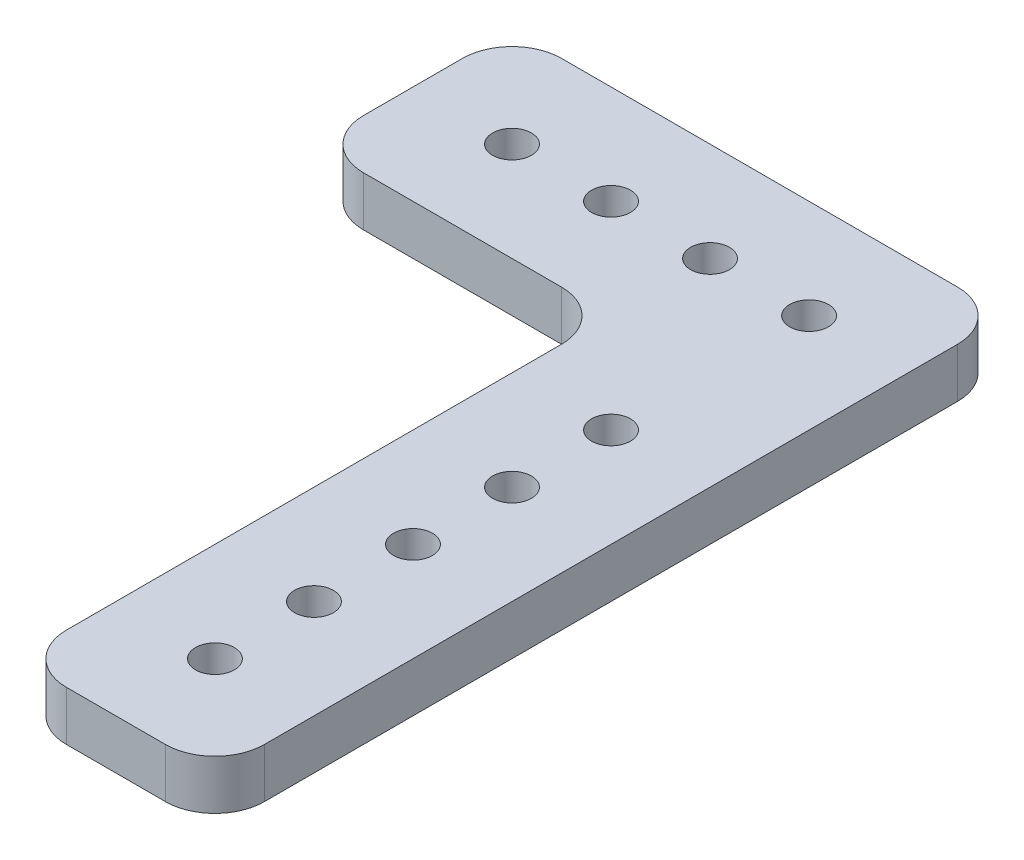
ISO-10303-21;
HEADER;
FILE_DESCRIPTION(('STEP AP214'),'2;1');
FILE_NAME('part.step','',(''),(''),'','','');
FILE_SCHEMA(('AUTOMOTIVE_DESIGN { 1 0 10303 214 1 1 1 1 }'));
ENDSEC;
DATA;
#1=APPLICATION_CONTEXT('core data for automotive mechanical design processes');
#2=APPLICATION_PROTOCOL_DEFINITION('international standard','automotive_design',2000,#1);
#3=PRODUCT_CONTEXT('',#1,'mechanical');
#4=PRODUCT('Part','Part','',(#3));
#5=PRODUCT_RELATED_PRODUCT_CATEGORY('part','',(#4));
#6=PRODUCT_DEFINITION_FORMATION('','',#4);
#7=PRODUCT_DEFINITION_CONTEXT('part definition',#1,'design');
#8=PRODUCT_DEFINITION('design','',#6,#7);
#9=PRODUCT_DEFINITION_SHAPE('','',#8);
#10=(LENGTH_UNIT() NAMED_UNIT(*) SI_UNIT(.MILLI.,.METRE.));
#11=(NAMED_UNIT(*) PLANE_ANGLE_UNIT() SI_UNIT($,.RADIAN.));
#12=(NAMED_UNIT(*) SI_UNIT($,.STERADIAN.) SOLID_ANGLE_UNIT());
#13=UNCERTAINTY_MEASURE_WITH_UNIT(LENGTH_MEASURE(1.E-05),#10,'distance_accuracy_value','');
#14=(GEOMETRIC_REPRESENTATION_CONTEXT(3) GLOBAL_UNCERTAINTY_ASSIGNED_CONTEXT((#13)) GLOBAL_UNIT_ASSIGNED_CONTEXT((#10,
#11,#12)) REPRESENTATION_CONTEXT('',''));
#15=CARTESIAN_POINT('',(0.,0.,0.));
#16=DIRECTION('',(0.,0.,1.));
#17=DIRECTION('',(1.,0.,0.));
#18=AXIS2_PLACEMENT_3D('',#15,#16,#17);
#19=CARTESIAN_POINT('',(25.4,6.35,0.));
#20=DIRECTION('',(-1.,0.,0.));
#21=DIRECTION('',(0.,0.,1.));
#22=AXIS2_PLACEMENT_3D('',#19,#20,#21);
#23=PLANE('',#22);
#24=DIRECTION('',(0.,0.,-1.));
#25=VECTOR('',#24,1.);
#26=CARTESIAN_POINT('',(25.4,0.,0.));
#27=LINE('',#26,#25);
#28=CARTESIAN_POINT('',(25.4,0.,-6.35));
#29=VERTEX_POINT('',#28);
#30=CARTESIAN_POINT('',(25.4,0.,-95.25));
#31=VERTEX_POINT('',#30);
#32=EDGE_CURVE('E332',#29,#31,#27,.T.);
#33=ORIENTED_EDGE('',*,*,#32,.T.);
#34=DIRECTION('',(0.,-1.,0.));
#35=VECTOR('',#34,1.);
#36=CARTESIAN_POINT('',(25.4,6.35,-95.25));
#37=LINE('',#36,#35);
#38=CARTESIAN_POINT('',(25.4,6.35,-95.25));
#39=VERTEX_POINT('',#38);
#40=EDGE_CURVE('E268',#31,#39,#37,.F.);
#41=ORIENTED_EDGE('',*,*,#40,.T.);
#42=DIRECTION('',(0.,0.,-1.));
#43=VECTOR('',#42,1.);
#44=CARTESIAN_POINT('',(25.4,6.35,0.));
#45=LINE('',#44,#43);
#46=CARTESIAN_POINT('',(25.4,6.35,-6.35));
#47=VERTEX_POINT('',#46);
#48=EDGE_CURVE('E211',#47,#39,#45,.T.);
#49=ORIENTED_EDGE('',*,*,#48,.F.);
#50=DIRECTION('',(0.,-1.,0.));
#51=VECTOR('',#50,1.);
#52=CARTESIAN_POINT('',(25.4,6.35,-6.35));
#53=LINE('',#52,#51);
#54=EDGE_CURVE('E264',#47,#29,#53,.T.);
#55=ORIENTED_EDGE('',*,*,#54,.T.);
#56=EDGE_LOOP('',(#33,#41,#49,#55));
#57=FACE_BOUND('',#56,.T.);
#58=ADVANCED_FACE('F47',(#57),#23,.F.);
#59=CARTESIAN_POINT('',(0.,6.35,-101.6));
#60=DIRECTION('',(0.,0.,1.));
#61=DIRECTION('',(1.,0.,0.));
#62=AXIS2_PLACEMENT_3D('',#59,#60,#61);
#63=PLANE('',#62);
#64=DIRECTION('',(-1.,0.,0.));
#65=VECTOR('',#64,1.);
#66=CARTESIAN_POINT('',(0.,0.,-101.6));
#67=LINE('',#66,#65);
#68=CARTESIAN_POINT('',(19.05,0.,-101.6));
#69=VERTEX_POINT('',#68);
#70=CARTESIAN_POINT('',(-31.75,0.,-101.6));
#71=VERTEX_POINT('',#70);
#72=EDGE_CURVE('E336',#69,#71,#67,.T.);
#73=ORIENTED_EDGE('',*,*,#72,.T.);
#74=DIRECTION('',(0.,-1.,0.));
#75=VECTOR('',#74,1.);
#76=CARTESIAN_POINT('',(-31.75,6.35,-101.6));
#77=LINE('',#76,#75);
#78=CARTESIAN_POINT('',(-31.75,6.35,-101.6));
#79=VERTEX_POINT('',#78);
#80=EDGE_CURVE('E261',#71,#79,#77,.F.);
#81=ORIENTED_EDGE('',*,*,#80,.T.);
#82=DIRECTION('',(-1.,0.,0.));
#83=VECTOR('',#82,1.);
#84=CARTESIAN_POINT('',(0.,6.35,-101.6));
#85=LINE('',#84,#83);
#86=CARTESIAN_POINT('',(19.05,6.35,-101.6));
#87=VERTEX_POINT('',#86);
#88=EDGE_CURVE('E511',#87,#79,#85,.T.);
#89=ORIENTED_EDGE('',*,*,#88,.F.);
#90=DIRECTION('',(0.,-1.,0.));
#91=VECTOR('',#90,1.);
#92=CARTESIAN_POINT('',(19.05,6.35,-101.6));
#93=LINE('',#92,#91);
#94=EDGE_CURVE('E257',#87,#69,#93,.T.);
#95=ORIENTED_EDGE('',*,*,#94,.T.);
#96=EDGE_LOOP('',(#73,#81,#89,#95));
#97=FACE_BOUND('',#96,.T.);
#98=ADVANCED_FACE('F362',(#97),#63,.F.);
#99=CARTESIAN_POINT('',(-38.1,6.35,0.));
#100=DIRECTION('',(1.,0.,0.));
#101=DIRECTION('',(0.,0.,-1.));
#102=AXIS2_PLACEMENT_3D('',#99,#100,#101);
#103=PLANE('',#102);
#104=DIRECTION('',(0.,0.,1.));
#105=VECTOR('',#104,1.);
#106=CARTESIAN_POINT('',(-38.1,0.,0.));
#107=LINE('',#106,#105);
#108=CARTESIAN_POINT('',(-38.1,0.,-95.25));
#109=VERTEX_POINT('',#108);
#110=CARTESIAN_POINT('',(-38.1,0.,-82.55));
#111=VERTEX_POINT('',#110);
#112=EDGE_CURVE('E277',#109,#111,#107,.T.);
#113=ORIENTED_EDGE('',*,*,#112,.T.);
#114=DIRECTION('',(0.,-1.,0.));
#115=VECTOR('',#114,1.);
#116=CARTESIAN_POINT('',(-38.1,6.35,-82.55));
#117=LINE('',#116,#115);
#118=CARTESIAN_POINT('',(-38.1,6.35,-82.55));
#119=VERTEX_POINT('',#118);
#120=EDGE_CURVE('E254',#111,#119,#117,.F.);
#121=ORIENTED_EDGE('',*,*,#120,.T.);
#122=DIRECTION('',(0.,0.,1.));
#123=VECTOR('',#122,1.);
#124=CARTESIAN_POINT('',(-38.1,6.35,0.));
#125=LINE('',#124,#123);
#126=CARTESIAN_POINT('',(-38.1,6.35,-95.25));
#127=VERTEX_POINT('',#126);
#128=EDGE_CURVE('E294',#127,#119,#125,.T.);
#129=ORIENTED_EDGE('',*,*,#128,.F.);
#130=DIRECTION('',(0.,-1.,0.));
#131=VECTOR('',#130,1.);
#132=CARTESIAN_POINT('',(-38.1,6.35,-95.25));
#133=LINE('',#132,#131);
#134=EDGE_CURVE('E250',#127,#109,#133,.T.);
#135=ORIENTED_EDGE('',*,*,#134,.T.);
#136=EDGE_LOOP('',(#113,#121,#129,#135));
#137=FACE_BOUND('',#136,.T.);
#138=ADVANCED_FACE('F345',(#137),#103,.F.);
#139=CARTESIAN_POINT('',(0.,6.35,-76.2));
#140=DIRECTION('',(0.,0.,1.));
#141=DIRECTION('',(1.,0.,0.));
#142=AXIS2_PLACEMENT_3D('',#139,#140,#141);
#143=PLANE('',#142);
#144=DIRECTION('',(-1.,0.,0.));
#145=VECTOR('',#144,1.);
#146=CARTESIAN_POINT('',(0.,0.,-76.2));
#147=LINE('',#146,#145);
#148=CARTESIAN_POINT('',(-6.35,0.,-76.2));
#149=VERTEX_POINT('',#148);
#150=CARTESIAN_POINT('',(-31.75,0.,-76.2));
#151=VERTEX_POINT('',#150);
#152=EDGE_CURVE('E176',#149,#151,#147,.T.);
#153=ORIENTED_EDGE('',*,*,#152,.F.);
#154=DIRECTION('',(0.,-1.,0.));
#155=VECTOR('',#154,1.);
#156=CARTESIAN_POINT('',(-6.35,6.35,-76.2));
#157=LINE('',#156,#155);
#158=CARTESIAN_POINT('',(-6.35,6.35,-76.2));
#159=VERTEX_POINT('',#158);
#160=EDGE_CURVE('E70',#149,#159,#157,.F.);
#161=ORIENTED_EDGE('',*,*,#160,.T.);
#162=DIRECTION('',(-1.,0.,0.));
#163=VECTOR('',#162,1.);
#164=CARTESIAN_POINT('',(0.,6.35,-76.2));
#165=LINE('',#164,#163);
#166=CARTESIAN_POINT('',(-31.75,6.35,-76.2));
#167=VERTEX_POINT('',#166);
#168=EDGE_CURVE('E285',#159,#167,#165,.T.);
#169=ORIENTED_EDGE('',*,*,#168,.T.);
#170=DIRECTION('',(0.,-1.,0.));
#171=VECTOR('',#170,1.);
#172=CARTESIAN_POINT('',(-31.75,0.,-76.2));
#173=LINE('',#172,#171);
#174=EDGE_CURVE('E244',#167,#151,#173,.T.);
#175=ORIENTED_EDGE('',*,*,#174,.T.);
#176=EDGE_LOOP('',(#153,#161,#169,#175));
#177=FACE_BOUND('',#176,.T.);
#178=ADVANCED_FACE('F274',(#177),#143,.T.);
#179=CARTESIAN_POINT('',(0.,6.35,0.));
#180=DIRECTION('',(-1.,0.,0.));
#181=DIRECTION('',(0.,0.,1.));
#182=AXIS2_PLACEMENT_3D('',#179,#180,#181);
#183=PLANE('',#182);
#184=DIRECTION('',(0.,0.,-1.));
#185=VECTOR('',#184,1.);
#186=CARTESIAN_POINT('',(0.,0.,0.));
#187=LINE('',#186,#185);
#188=CARTESIAN_POINT('',(0.,0.,-6.35));
#189=VERTEX_POINT('',#188);
#190=CARTESIAN_POINT('',(0.,0.,-69.85));
#191=VERTEX_POINT('',#190);
#192=EDGE_CURVE('E169',#189,#191,#187,.T.);
#193=ORIENTED_EDGE('',*,*,#192,.F.);
#194=DIRECTION('',(0.,-1.,0.));
#195=VECTOR('',#194,1.);
#196=CARTESIAN_POINT('',(0.,6.35,-6.35));
#197=LINE('',#196,#195);
#198=CARTESIAN_POINT('',(0.,6.35,-6.35));
#199=VERTEX_POINT('',#198);
#200=EDGE_CURVE('E143',#189,#199,#197,.F.);
#201=ORIENTED_EDGE('',*,*,#200,.T.);
#202=DIRECTION('',(0.,0.,-1.));
#203=VECTOR('',#202,1.);
#204=CARTESIAN_POINT('',(0.,6.35,0.));
#205=LINE('',#204,#203);
#206=CARTESIAN_POINT('',(0.,6.35,-69.85));
#207=VERTEX_POINT('',#206);
#208=EDGE_CURVE('E284',#199,#207,#205,.T.);
#209=ORIENTED_EDGE('',*,*,#208,.T.);
#210=DIRECTION('',(0.,-1.,0.));
#211=VECTOR('',#210,1.);
#212=CARTESIAN_POINT('',(0.,0.,-69.85));
#213=LINE('',#212,#211);
#214=EDGE_CURVE('E149',#207,#191,#213,.T.);
#215=ORIENTED_EDGE('',*,*,#214,.T.);
#216=EDGE_LOOP('',(#193,#201,#209,#215));
#217=FACE_BOUND('',#216,.T.);
#218=ADVANCED_FACE('F287',(#217),#183,.T.);
#219=CARTESIAN_POINT('',(12.7,6.35,-50.8));
#220=DIRECTION('',(0.,-1.,0.));
#221=DIRECTION('',(0.,0.,-1.));
#222=AXIS2_PLACEMENT_3D('',#219,#220,#221);
#223=CYLINDRICAL_SURFACE('',#222,2.4892);
#224=CARTESIAN_POINT('',(12.7,6.35,-50.8));
#225=DIRECTION('',(0.,1.,0.));
#226=DIRECTION('',(0.,0.,1.));
#227=AXIS2_PLACEMENT_3D('',#224,#225,#226);
#228=CIRCLE('',#227,2.4892);
#229=CARTESIAN_POINT('',(12.7,6.35,-48.3108));
#230=VERTEX_POINT('',#229);
#231=EDGE_CURVE('E325',#230,#230,#228,.T.);
#232=ORIENTED_EDGE('',*,*,#231,.T.);
#233=EDGE_LOOP('',(#232));
#234=FACE_BOUND('',#233,.T.);
#235=CARTESIAN_POINT('',(12.7,0.,-50.8));
#236=DIRECTION('',(0.,1.,0.));
#237=DIRECTION('',(0.,0.,1.));
#238=AXIS2_PLACEMENT_3D('',#235,#236,#237);
#239=CIRCLE('',#238,2.4892);
#240=CARTESIAN_POINT('',(12.7,0.,-48.3108));
#241=VERTEX_POINT('',#240);
#242=EDGE_CURVE('E203',#241,#241,#239,.T.);
#243=ORIENTED_EDGE('',*,*,#242,.F.);
#244=EDGE_LOOP('',(#243));
#245=FACE_BOUND('',#244,.T.);
#246=ADVANCED_FACE('F386',(#234,#245),#223,.F.);
#247=CARTESIAN_POINT('',(12.7,6.35,-38.1));
#248=DIRECTION('',(0.,-1.,0.));
#249=DIRECTION('',(0.,0.,-1.));
#250=AXIS2_PLACEMENT_3D('',#247,#248,#249);
#251=CYLINDRICAL_SURFACE('',#250,2.4892);
#252=CARTESIAN_POINT('',(12.7,6.35,-38.1));
#253=DIRECTION('',(0.,1.,0.));
#254=DIRECTION('',(0.,0.,1.));
#255=AXIS2_PLACEMENT_3D('',#252,#253,#254);
#256=CIRCLE('',#255,2.4892);
#257=CARTESIAN_POINT('',(12.7,6.35,-35.6108));
#258=VERTEX_POINT('',#257);
#259=EDGE_CURVE('E321',#258,#258,#256,.T.);
#260=ORIENTED_EDGE('',*,*,#259,.T.);
#261=EDGE_LOOP('',(#260));
#262=FACE_BOUND('',#261,.T.);
#263=CARTESIAN_POINT('',(12.7,0.,-38.1));
#264=DIRECTION('',(0.,1.,0.));
#265=DIRECTION('',(0.,0.,1.));
#266=AXIS2_PLACEMENT_3D('',#263,#264,#265);
#267=CIRCLE('',#266,2.4892);
#268=CARTESIAN_POINT('',(12.7,0.,-35.6108));
#269=VERTEX_POINT('',#268);
#270=EDGE_CURVE('E199',#269,#269,#267,.T.);
#271=ORIENTED_EDGE('',*,*,#270,.F.);
#272=EDGE_LOOP('',(#271));
#273=FACE_BOUND('',#272,.T.);
#274=ADVANCED_FACE('F389',(#262,#273),#251,.F.);
#275=CARTESIAN_POINT('',(12.7,6.35,-25.4));
#276=DIRECTION('',(0.,-1.,0.));
#277=DIRECTION('',(0.,0.,-1.));
#278=AXIS2_PLACEMENT_3D('',#275,#276,#277);
#279=CYLINDRICAL_SURFACE('',#278,2.4892);
#280=CARTESIAN_POINT('',(12.7,6.35,-25.4));
#281=DIRECTION('',(0.,1.,0.));
#282=DIRECTION('',(0.,0.,1.));
#283=AXIS2_PLACEMENT_3D('',#280,#281,#282);
#284=CIRCLE('',#283,2.4892);
#285=CARTESIAN_POINT('',(12.7,6.35,-22.9108));
#286=VERTEX_POINT('',#285);
#287=EDGE_CURVE('E317',#286,#286,#284,.T.);
#288=ORIENTED_EDGE('',*,*,#287,.T.);
#289=EDGE_LOOP('',(#288));
#290=FACE_BOUND('',#289,.T.);
#291=CARTESIAN_POINT('',(12.7,0.,-25.4));
#292=DIRECTION('',(0.,1.,0.));
#293=DIRECTION('',(0.,0.,1.));
#294=AXIS2_PLACEMENT_3D('',#291,#292,#293);
#295=CIRCLE('',#294,2.4892);
#296=CARTESIAN_POINT('',(12.7,0.,-22.9108));
#297=VERTEX_POINT('',#296);
#298=EDGE_CURVE('E195',#297,#297,#295,.T.);
#299=ORIENTED_EDGE('',*,*,#298,.F.);
#300=EDGE_LOOP('',(#299));
#301=FACE_BOUND('',#300,.T.);
#302=ADVANCED_FACE('F393',(#290,#301),#279,.F.);
#303=CARTESIAN_POINT('',(12.7,6.35,-12.7));
#304=DIRECTION('',(0.,-1.,0.));
#305=DIRECTION('',(0.,0.,-1.));
#306=AXIS2_PLACEMENT_3D('',#303,#304,#305);
#307=CYLINDRICAL_SURFACE('',#306,2.4892);
#308=CARTESIAN_POINT('',(12.7,6.35,-12.7));
#309=DIRECTION('',(0.,1.,0.));
#310=DIRECTION('',(0.,0.,1.));
#311=AXIS2_PLACEMENT_3D('',#308,#309,#310);
#312=CIRCLE('',#311,2.4892);
#313=CARTESIAN_POINT('',(12.7,6.35,-10.2108));
#314=VERTEX_POINT('',#313);
#315=EDGE_CURVE('E313',#314,#314,#312,.T.);
#316=ORIENTED_EDGE('',*,*,#315,.T.);
#317=EDGE_LOOP('',(#316));
#318=FACE_BOUND('',#317,.T.);
#319=CARTESIAN_POINT('',(12.7,0.,-12.7));
#320=DIRECTION('',(0.,1.,0.));
#321=DIRECTION('',(0.,0.,1.));
#322=AXIS2_PLACEMENT_3D('',#319,#320,#321);
#323=CIRCLE('',#322,2.4892);
#324=CARTESIAN_POINT('',(12.7,0.,-10.2108));
#325=VERTEX_POINT('',#324);
#326=EDGE_CURVE('E191',#325,#325,#323,.T.);
#327=ORIENTED_EDGE('',*,*,#326,.F.);
#328=EDGE_LOOP('',(#327));
#329=FACE_BOUND('',#328,.T.);
#330=ADVANCED_FACE('F397',(#318,#329),#307,.F.);
#331=CARTESIAN_POINT('',(12.7,6.35,-88.9));
#332=DIRECTION('',(0.,-1.,0.));
#333=DIRECTION('',(0.,0.,-1.));
#334=AXIS2_PLACEMENT_3D('',#331,#332,#333);
#335=CYLINDRICAL_SURFACE('',#334,2.4892);
#336=CARTESIAN_POINT('',(12.7,6.35,-88.9));
#337=DIRECTION('',(0.,1.,0.));
#338=DIRECTION('',(0.,0.,1.));
#339=AXIS2_PLACEMENT_3D('',#336,#337,#338);
#340=CIRCLE('',#339,2.4892);
#341=CARTESIAN_POINT('',(12.7,6.35,-86.4108));
#342=VERTEX_POINT('',#341);
#343=EDGE_CURVE('E309',#342,#342,#340,.T.);
#344=ORIENTED_EDGE('',*,*,#343,.T.);
#345=EDGE_LOOP('',(#344));
#346=FACE_BOUND('',#345,.T.);
#347=CARTESIAN_POINT('',(12.7,0.,-88.9));
#348=DIRECTION('',(0.,1.,0.));
#349=DIRECTION('',(0.,0.,1.));
#350=AXIS2_PLACEMENT_3D('',#347,#348,#349);
#351=CIRCLE('',#350,2.4892);
#352=CARTESIAN_POINT('',(12.7,0.,-86.4108));
#353=VERTEX_POINT('',#352);
#354=EDGE_CURVE('E187',#353,#353,#351,.T.);
#355=ORIENTED_EDGE('',*,*,#354,.F.);
#356=EDGE_LOOP('',(#355));
#357=FACE_BOUND('',#356,.T.);
#358=ADVANCED_FACE('F401',(#346,#357),#335,.F.);
#359=CARTESIAN_POINT('',(-25.4,6.35,-88.9));
#360=DIRECTION('',(0.,-1.,0.));
#361=DIRECTION('',(0.,0.,-1.));
#362=AXIS2_PLACEMENT_3D('',#359,#360,#361);
#363=CYLINDRICAL_SURFACE('',#362,2.4892);
#364=CARTESIAN_POINT('',(-25.4,6.35,-88.9));
#365=DIRECTION('',(0.,1.,0.));
#366=DIRECTION('',(0.,0.,1.));
#367=AXIS2_PLACEMENT_3D('',#364,#365,#366);
#368=CIRCLE('',#367,2.4892);
#369=CARTESIAN_POINT('',(-25.4,6.35,-86.4108));
#370=VERTEX_POINT('',#369);
#371=EDGE_CURVE('E305',#370,#370,#368,.T.);
#372=ORIENTED_EDGE('',*,*,#371,.T.);
#373=EDGE_LOOP('',(#372));
#374=FACE_BOUND('',#373,.T.);
#375=CARTESIAN_POINT('',(-25.4,0.,-88.9));
#376=DIRECTION('',(0.,1.,0.));
#377=DIRECTION('',(0.,0.,1.));
#378=AXIS2_PLACEMENT_3D('',#375,#376,#377);
#379=CIRCLE('',#378,2.4892);
#380=CARTESIAN_POINT('',(-25.4,0.,-86.4108));
#381=VERTEX_POINT('',#380);
#382=EDGE_CURVE('E183',#381,#381,#379,.T.);
#383=ORIENTED_EDGE('',*,*,#382,.F.);
#384=EDGE_LOOP('',(#383));
#385=FACE_BOUND('',#384,.T.);
#386=ADVANCED_FACE('F405',(#374,#385),#363,.F.);
#387=CARTESIAN_POINT('',(-12.7,6.35,-88.9));
#388=DIRECTION('',(0.,-1.,0.));
#389=DIRECTION('',(0.,0.,-1.));
#390=AXIS2_PLACEMENT_3D('',#387,#388,#389);
#391=CYLINDRICAL_SURFACE('',#390,2.4892);
#392=CARTESIAN_POINT('',(-12.7,6.35,-88.9));
#393=DIRECTION('',(0.,1.,0.));
#394=DIRECTION('',(0.,0.,1.));
#395=AXIS2_PLACEMENT_3D('',#392,#393,#394);
#396=CIRCLE('',#395,2.4892);
#397=CARTESIAN_POINT('',(-12.7,6.35,-86.4108));
#398=VERTEX_POINT('',#397);
#399=EDGE_CURVE('E301',#398,#398,#396,.T.);
#400=ORIENTED_EDGE('',*,*,#399,.T.);
#401=EDGE_LOOP('',(#400));
#402=FACE_BOUND('',#401,.T.);
#403=CARTESIAN_POINT('',(-12.7,0.,-88.9));
#404=DIRECTION('',(0.,1.,0.));
#405=DIRECTION('',(0.,0.,1.));
#406=AXIS2_PLACEMENT_3D('',#403,#404,#405);
#407=CIRCLE('',#406,2.4892);
#408=CARTESIAN_POINT('',(-12.7,0.,-86.4108));
#409=VERTEX_POINT('',#408);
#410=EDGE_CURVE('E174',#409,#409,#407,.T.);
#411=ORIENTED_EDGE('',*,*,#410,.F.);
#412=EDGE_LOOP('',(#411));
#413=FACE_BOUND('',#412,.T.);
#414=ADVANCED_FACE('F409',(#402,#413),#391,.F.);
#415=CARTESIAN_POINT('',(0.,6.35,-88.9));
#416=DIRECTION('',(0.,-1.,0.));
#417=DIRECTION('',(0.,0.,-1.));
#418=AXIS2_PLACEMENT_3D('',#415,#416,#417);
#419=CYLINDRICAL_SURFACE('',#418,2.4892);
#420=CARTESIAN_POINT('',(0.,6.35,-88.9));
#421=DIRECTION('',(0.,1.,0.));
#422=DIRECTION('',(0.,0.,1.));
#423=AXIS2_PLACEMENT_3D('',#420,#421,#422);
#424=CIRCLE('',#423,2.4892);
#425=CARTESIAN_POINT('',(0.,6.35,-86.4108));
#426=VERTEX_POINT('',#425);
#427=EDGE_CURVE('E292',#426,#426,#424,.T.);
#428=ORIENTED_EDGE('',*,*,#427,.T.);
#429=EDGE_LOOP('',(#428));
#430=FACE_BOUND('',#429,.T.);
#431=CARTESIAN_POINT('',(0.,0.,-88.9));
#432=DIRECTION('',(0.,1.,0.));
#433=DIRECTION('',(0.,0.,1.));
#434=AXIS2_PLACEMENT_3D('',#431,#432,#433);
#435=CIRCLE('',#434,2.4892);
#436=CARTESIAN_POINT('',(0.,0.,-86.4108));
#437=VERTEX_POINT('',#436);
#438=EDGE_CURVE('E168',#437,#437,#435,.T.);
#439=ORIENTED_EDGE('',*,*,#438,.F.);
#440=EDGE_LOOP('',(#439));
#441=FACE_BOUND('',#440,.T.);
#442=ADVANCED_FACE('F413',(#430,#441),#419,.F.);
#443=CARTESIAN_POINT('',(0.,6.35,0.));
#444=DIRECTION('',(0.,0.,-1.));
#445=DIRECTION('',(-1.,0.,0.));
#446=AXIS2_PLACEMENT_3D('',#443,#444,#445);
#447=PLANE('',#446);
#448=DIRECTION('',(1.,0.,0.));
#449=VECTOR('',#448,1.);
#450=CARTESIAN_POINT('',(0.,6.35,0.));
#451=LINE('',#450,#449);
#452=CARTESIAN_POINT('',(6.35,6.35,0.));
#453=VERTEX_POINT('',#452);
#454=CARTESIAN_POINT('',(19.05,6.35,0.));
#455=VERTEX_POINT('',#454);
#456=EDGE_CURVE('E159',#453,#455,#451,.T.);
#457=ORIENTED_EDGE('',*,*,#456,.F.);
#458=DIRECTION('',(0.,-1.,0.));
#459=VECTOR('',#458,1.);
#460=CARTESIAN_POINT('',(6.35,0.,0.));
#461=LINE('',#460,#459);
#462=CARTESIAN_POINT('',(6.35,0.,0.));
#463=VERTEX_POINT('',#462);
#464=EDGE_CURVE('E142',#453,#463,#461,.T.);
#465=ORIENTED_EDGE('',*,*,#464,.T.);
#466=DIRECTION('',(1.,0.,0.));
#467=VECTOR('',#466,1.);
#468=CARTESIAN_POINT('',(0.,0.,0.));
#469=LINE('',#468,#467);
#470=CARTESIAN_POINT('',(19.05,0.,0.));
#471=VERTEX_POINT('',#470);
#472=EDGE_CURVE('E156',#463,#471,#469,.T.);
#473=ORIENTED_EDGE('',*,*,#472,.T.);
#474=DIRECTION('',(0.,-1.,0.));
#475=VECTOR('',#474,1.);
#476=CARTESIAN_POINT('',(19.05,6.35,0.));
#477=LINE('',#476,#475);
#478=EDGE_CURVE('E162',#471,#455,#477,.F.);
#479=ORIENTED_EDGE('',*,*,#478,.T.);
#480=EDGE_LOOP('',(#457,#465,#473,#479));
#481=FACE_BOUND('',#480,.T.);
#482=ADVANCED_FACE('F155',(#481),#447,.F.);
#483=CARTESIAN_POINT('',(12.7,6.35,-63.5));
#484=DIRECTION('',(0.,-1.,0.));
#485=DIRECTION('',(0.,0.,-1.));
#486=AXIS2_PLACEMENT_3D('',#483,#484,#485);
#487=CYLINDRICAL_SURFACE('',#486,2.48919999999999);
#488=CARTESIAN_POINT('',(12.7,6.35,-63.5));
#489=DIRECTION('',(0.,1.,0.));
#490=DIRECTION('',(0.,0.,1.));
#491=AXIS2_PLACEMENT_3D('',#488,#489,#490);
#492=CIRCLE('',#491,2.48919999999999);
#493=CARTESIAN_POINT('',(12.7,6.35,-61.0108));
#494=VERTEX_POINT('',#493);
#495=EDGE_CURVE('E213',#494,#494,#492,.T.);
#496=ORIENTED_EDGE('',*,*,#495,.T.);
#497=EDGE_LOOP('',(#496));
#498=FACE_BOUND('',#497,.T.);
#499=CARTESIAN_POINT('',(12.7,0.,-63.5));
#500=DIRECTION('',(0.,1.,0.));
#501=DIRECTION('',(0.,0.,1.));
#502=AXIS2_PLACEMENT_3D('',#499,#500,#501);
#503=CIRCLE('',#502,2.48919999999999);
#504=CARTESIAN_POINT('',(12.7,0.,-61.0108));
#505=VERTEX_POINT('',#504);
#506=EDGE_CURVE('E207',#505,#505,#503,.T.);
#507=ORIENTED_EDGE('',*,*,#506,.F.);
#508=EDGE_LOOP('',(#507));
#509=FACE_BOUND('',#508,.T.);
#510=ADVANCED_FACE('F381',(#498,#509),#487,.F.);
#511=CARTESIAN_POINT('',(0.,6.35,0.));
#512=DIRECTION('',(0.,1.,0.));
#513=DIRECTION('',(0.,0.,1.));
#514=AXIS2_PLACEMENT_3D('',#511,#512,#513);
#515=PLANE('',#514);
#516=ORIENTED_EDGE('',*,*,#208,.F.);
#517=CARTESIAN_POINT('',(6.35,6.35,-6.35));
#518=DIRECTION('',(0.,1.,0.));
#519=DIRECTION('',(0.,0.,1.));
#520=AXIS2_PLACEMENT_3D('',#517,#518,#519);
#521=CIRCLE('',#520,6.35);
#522=EDGE_CURVE('E241',#199,#453,#521,.T.);
#523=ORIENTED_EDGE('',*,*,#522,.T.);
#524=ORIENTED_EDGE('',*,*,#456,.T.);
#525=CARTESIAN_POINT('',(19.05,6.35,-6.35));
#526=DIRECTION('',(0.,1.,0.));
#527=DIRECTION('',(0.,0.,1.));
#528=AXIS2_PLACEMENT_3D('',#525,#526,#527);
#529=CIRCLE('',#528,6.35);
#530=EDGE_CURVE('E230',#455,#47,#529,.T.);
#531=ORIENTED_EDGE('',*,*,#530,.T.);
#532=ORIENTED_EDGE('',*,*,#48,.T.);
#533=CARTESIAN_POINT('',(19.05,6.35,-95.25));
#534=DIRECTION('',(0.,1.,0.));
#535=DIRECTION('',(0.,0.,1.));
#536=AXIS2_PLACEMENT_3D('',#533,#534,#535);
#537=CIRCLE('',#536,6.35);
#538=EDGE_CURVE('E233',#39,#87,#537,.T.);
#539=ORIENTED_EDGE('',*,*,#538,.T.);
#540=ORIENTED_EDGE('',*,*,#88,.T.);
#541=CARTESIAN_POINT('',(-31.75,6.35,-95.25));
#542=DIRECTION('',(0.,1.,0.));
#543=DIRECTION('',(0.,0.,1.));
#544=AXIS2_PLACEMENT_3D('',#541,#542,#543);
#545=CIRCLE('',#544,6.35);
#546=EDGE_CURVE('E236',#79,#127,#545,.T.);
#547=ORIENTED_EDGE('',*,*,#546,.T.);
#548=ORIENTED_EDGE('',*,*,#128,.T.);
#549=CARTESIAN_POINT('',(-31.75,6.35,-82.55));
#550=DIRECTION('',(0.,1.,0.));
#551=DIRECTION('',(0.,0.,1.));
#552=AXIS2_PLACEMENT_3D('',#549,#550,#551);
#553=CIRCLE('',#552,6.35);
#554=EDGE_CURVE('E63',#119,#167,#553,.T.);
#555=ORIENTED_EDGE('',*,*,#554,.T.);
#556=ORIENTED_EDGE('',*,*,#168,.F.);
#557=CARTESIAN_POINT('',(-6.35,6.35,-69.85));
#558=DIRECTION('',(0.,1.,0.));
#559=DIRECTION('',(0.,0.,1.));
#560=AXIS2_PLACEMENT_3D('',#557,#558,#559);
#561=CIRCLE('',#560,6.35);
#562=EDGE_CURVE('E11',#159,#207,#561,.F.);
#563=ORIENTED_EDGE('',*,*,#562,.T.);
#564=EDGE_LOOP('',(#516,#523,#524,#531,#532,#539,#540,#547,#548,#555,#556,#563));
#565=FACE_BOUND('',#564,.T.);
#566=ORIENTED_EDGE('',*,*,#427,.F.);
#567=EDGE_LOOP('',(#566));
#568=FACE_BOUND('',#567,.T.);
#569=ORIENTED_EDGE('',*,*,#399,.F.);
#570=EDGE_LOOP('',(#569));
#571=FACE_BOUND('',#570,.T.);
#572=ORIENTED_EDGE('',*,*,#371,.F.);
#573=EDGE_LOOP('',(#572));
#574=FACE_BOUND('',#573,.T.);
#575=ORIENTED_EDGE('',*,*,#343,.F.);
#576=EDGE_LOOP('',(#575));
#577=FACE_BOUND('',#576,.T.);
#578=ORIENTED_EDGE('',*,*,#315,.F.);
#579=EDGE_LOOP('',(#578));
#580=FACE_BOUND('',#579,.T.);
#581=ORIENTED_EDGE('',*,*,#287,.F.);
#582=EDGE_LOOP('',(#581));
#583=FACE_BOUND('',#582,.T.);
#584=ORIENTED_EDGE('',*,*,#259,.F.);
#585=EDGE_LOOP('',(#584));
#586=FACE_BOUND('',#585,.T.);
#587=ORIENTED_EDGE('',*,*,#231,.F.);
#588=EDGE_LOOP('',(#587));
#589=FACE_BOUND('',#588,.T.);
#590=ORIENTED_EDGE('',*,*,#495,.F.);
#591=EDGE_LOOP('',(#590));
#592=FACE_BOUND('',#591,.T.);
#593=ADVANCED_FACE('F282',(#565,#568,#571,#574,#577,#580,#583,#586,#589,#592),#515,.T.);
#594=CARTESIAN_POINT('',(0.,0.,0.));
#595=DIRECTION('',(0.,1.,0.));
#596=DIRECTION('',(0.,0.,1.));
#597=AXIS2_PLACEMENT_3D('',#594,#595,#596);
#598=PLANE('',#597);
#599=ORIENTED_EDGE('',*,*,#472,.F.);
#600=CARTESIAN_POINT('',(6.35,0.,-6.35));
#601=DIRECTION('',(0.,1.,0.));
#602=DIRECTION('',(0.,0.,1.));
#603=AXIS2_PLACEMENT_3D('',#600,#601,#602);
#604=CIRCLE('',#603,6.35);
#605=EDGE_CURVE('E138',#463,#189,#604,.F.);
#606=ORIENTED_EDGE('',*,*,#605,.T.);
#607=ORIENTED_EDGE('',*,*,#192,.T.);
#608=CARTESIAN_POINT('',(-6.35,0.,-69.85));
#609=DIRECTION('',(0.,1.,0.));
#610=DIRECTION('',(0.,0.,1.));
#611=AXIS2_PLACEMENT_3D('',#608,#609,#610);
#612=CIRCLE('',#611,6.35);
#613=EDGE_CURVE('E56',#191,#149,#612,.T.);
#614=ORIENTED_EDGE('',*,*,#613,.T.);
#615=ORIENTED_EDGE('',*,*,#152,.T.);
#616=CARTESIAN_POINT('',(-31.75,0.,-82.55));
#617=DIRECTION('',(0.,1.,0.));
#618=DIRECTION('',(0.,0.,1.));
#619=AXIS2_PLACEMENT_3D('',#616,#617,#618);
#620=CIRCLE('',#619,6.35);
#621=EDGE_CURVE('E150',#151,#111,#620,.F.);
#622=ORIENTED_EDGE('',*,*,#621,.T.);
#623=ORIENTED_EDGE('',*,*,#112,.F.);
#624=CARTESIAN_POINT('',(-31.75,0.,-95.25));
#625=DIRECTION('',(0.,1.,0.));
#626=DIRECTION('',(0.,0.,1.));
#627=AXIS2_PLACEMENT_3D('',#624,#625,#626);
#628=CIRCLE('',#627,6.35);
#629=EDGE_CURVE('E220',#109,#71,#628,.F.);
#630=ORIENTED_EDGE('',*,*,#629,.T.);
#631=ORIENTED_EDGE('',*,*,#72,.F.);
#632=CARTESIAN_POINT('',(19.05,0.,-95.25));
#633=DIRECTION('',(0.,1.,0.));
#634=DIRECTION('',(0.,0.,1.));
#635=AXIS2_PLACEMENT_3D('',#632,#633,#634);
#636=CIRCLE('',#635,6.35);
#637=EDGE_CURVE('E217',#69,#31,#636,.F.);
#638=ORIENTED_EDGE('',*,*,#637,.T.);
#639=ORIENTED_EDGE('',*,*,#32,.F.);
#640=CARTESIAN_POINT('',(19.05,0.,-6.35));
#641=DIRECTION('',(0.,1.,0.));
#642=DIRECTION('',(0.,0.,1.));
#643=AXIS2_PLACEMENT_3D('',#640,#641,#642);
#644=CIRCLE('',#643,6.35);
#645=EDGE_CURVE('E161',#29,#471,#644,.F.);
#646=ORIENTED_EDGE('',*,*,#645,.T.);
#647=EDGE_LOOP('',(#599,#606,#607,#614,#615,#622,#623,#630,#631,#638,#639,#646));
#648=FACE_BOUND('',#647,.T.);
#649=ORIENTED_EDGE('',*,*,#438,.T.);
#650=EDGE_LOOP('',(#649));
#651=FACE_BOUND('',#650,.T.);
#652=ORIENTED_EDGE('',*,*,#410,.T.);
#653=EDGE_LOOP('',(#652));
#654=FACE_BOUND('',#653,.T.);
#655=ORIENTED_EDGE('',*,*,#382,.T.);
#656=EDGE_LOOP('',(#655));
#657=FACE_BOUND('',#656,.T.);
#658=ORIENTED_EDGE('',*,*,#354,.T.);
#659=EDGE_LOOP('',(#658));
#660=FACE_BOUND('',#659,.T.);
#661=ORIENTED_EDGE('',*,*,#326,.T.);
#662=EDGE_LOOP('',(#661));
#663=FACE_BOUND('',#662,.T.);
#664=ORIENTED_EDGE('',*,*,#298,.T.);
#665=EDGE_LOOP('',(#664));
#666=FACE_BOUND('',#665,.T.);
#667=ORIENTED_EDGE('',*,*,#270,.T.);
#668=EDGE_LOOP('',(#667));
#669=FACE_BOUND('',#668,.T.);
#670=ORIENTED_EDGE('',*,*,#242,.T.);
#671=EDGE_LOOP('',(#670));
#672=FACE_BOUND('',#671,.T.);
#673=ORIENTED_EDGE('',*,*,#506,.T.);
#674=EDGE_LOOP('',(#673));
#675=FACE_BOUND('',#674,.T.);
#676=ADVANCED_FACE('F164',(#648,#651,#654,#657,#660,#663,#666,#669,#672,#675),#598,.F.);
#677=CARTESIAN_POINT('',(6.35,6.35,-6.35));
#678=DIRECTION('',(0.,1.,0.));
#679=DIRECTION('',(0.,0.,1.));
#680=AXIS2_PLACEMENT_3D('',#677,#678,#679);
#681=CYLINDRICAL_SURFACE('',#680,6.35);
#682=ORIENTED_EDGE('',*,*,#522,.F.);
#683=ORIENTED_EDGE('',*,*,#200,.F.);
#684=ORIENTED_EDGE('',*,*,#605,.F.);
#685=ORIENTED_EDGE('',*,*,#464,.F.);
#686=EDGE_LOOP('',(#682,#683,#684,#685));
#687=FACE_BOUND('',#686,.T.);
#688=ADVANCED_FACE('F141',(#687),#681,.T.);
#689=CARTESIAN_POINT('',(-6.35,6.35,-69.85));
#690=DIRECTION('',(0.,1.,0.));
#691=DIRECTION('',(0.,0.,1.));
#692=AXIS2_PLACEMENT_3D('',#689,#690,#691);
#693=CYLINDRICAL_SURFACE('',#692,6.35);
#694=ORIENTED_EDGE('',*,*,#562,.F.);
#695=ORIENTED_EDGE('',*,*,#160,.F.);
#696=ORIENTED_EDGE('',*,*,#613,.F.);
#697=ORIENTED_EDGE('',*,*,#214,.F.);
#698=EDGE_LOOP('',(#694,#695,#696,#697));
#699=FACE_BOUND('',#698,.T.);
#700=ADVANCED_FACE('F279',(#699),#693,.F.);
#701=CARTESIAN_POINT('',(-31.75,6.35,-82.55));
#702=DIRECTION('',(0.,1.,0.));
#703=DIRECTION('',(0.,0.,1.));
#704=AXIS2_PLACEMENT_3D('',#701,#702,#703);
#705=CYLINDRICAL_SURFACE('',#704,6.35);
#706=ORIENTED_EDGE('',*,*,#554,.F.);
#707=ORIENTED_EDGE('',*,*,#120,.F.);
#708=ORIENTED_EDGE('',*,*,#621,.F.);
#709=ORIENTED_EDGE('',*,*,#174,.F.);
#710=EDGE_LOOP('',(#706,#707,#708,#709));
#711=FACE_BOUND('',#710,.T.);
#712=ADVANCED_FACE('F349',(#711),#705,.T.);
#713=CARTESIAN_POINT('',(-31.75,6.35,-95.25));
#714=DIRECTION('',(0.,-1.,0.));
#715=DIRECTION('',(0.,0.,-1.));
#716=AXIS2_PLACEMENT_3D('',#713,#714,#715);
#717=CYLINDRICAL_SURFACE('',#716,6.35);
#718=ORIENTED_EDGE('',*,*,#546,.F.);
#719=ORIENTED_EDGE('',*,*,#80,.F.);
#720=ORIENTED_EDGE('',*,*,#629,.F.);
#721=ORIENTED_EDGE('',*,*,#134,.F.);
#722=EDGE_LOOP('',(#718,#719,#720,#721));
#723=FACE_BOUND('',#722,.T.);
#724=ADVANCED_FACE('F351',(#723),#717,.T.);
#725=CARTESIAN_POINT('',(19.05,6.35,-95.25));
#726=DIRECTION('',(0.,-1.,0.));
#727=DIRECTION('',(0.,0.,-1.));
#728=AXIS2_PLACEMENT_3D('',#725,#726,#727);
#729=CYLINDRICAL_SURFACE('',#728,6.35);
#730=ORIENTED_EDGE('',*,*,#538,.F.);
#731=ORIENTED_EDGE('',*,*,#40,.F.);
#732=ORIENTED_EDGE('',*,*,#637,.F.);
#733=ORIENTED_EDGE('',*,*,#94,.F.);
#734=EDGE_LOOP('',(#730,#731,#732,#733));
#735=FACE_BOUND('',#734,.T.);
#736=ADVANCED_FACE('F357',(#735),#729,.T.);
#737=CARTESIAN_POINT('',(19.05,6.35,-6.35));
#738=DIRECTION('',(0.,-1.,0.));
#739=DIRECTION('',(0.,0.,-1.));
#740=AXIS2_PLACEMENT_3D('',#737,#738,#739);
#741=CYLINDRICAL_SURFACE('',#740,6.35);
#742=ORIENTED_EDGE('',*,*,#530,.F.);
#743=ORIENTED_EDGE('',*,*,#478,.F.);
#744=ORIENTED_EDGE('',*,*,#645,.F.);
#745=ORIENTED_EDGE('',*,*,#54,.F.);
#746=EDGE_LOOP('',(#742,#743,#744,#745));
#747=FACE_BOUND('',#746,.T.);
#748=ADVANCED_FACE('F49',(#747),#741,.T.);
#749=CLOSED_SHELL('',(#58,#98,#138,#178,#218,#246,#274,#302,#330,#358,#386,#414,#442,#482,#510,
#593,#676,#688,#700,#712,#724,#736,#748));
#750=MANIFOLD_SOLID_BREP('B2',#749);
#751=ADVANCED_BREP_SHAPE_REPRESENTATION('',(#18,#750),#14);
#752=SHAPE_DEFINITION_REPRESENTATION(#9,#751);
ENDSEC;
END-ISO-10303-21;
